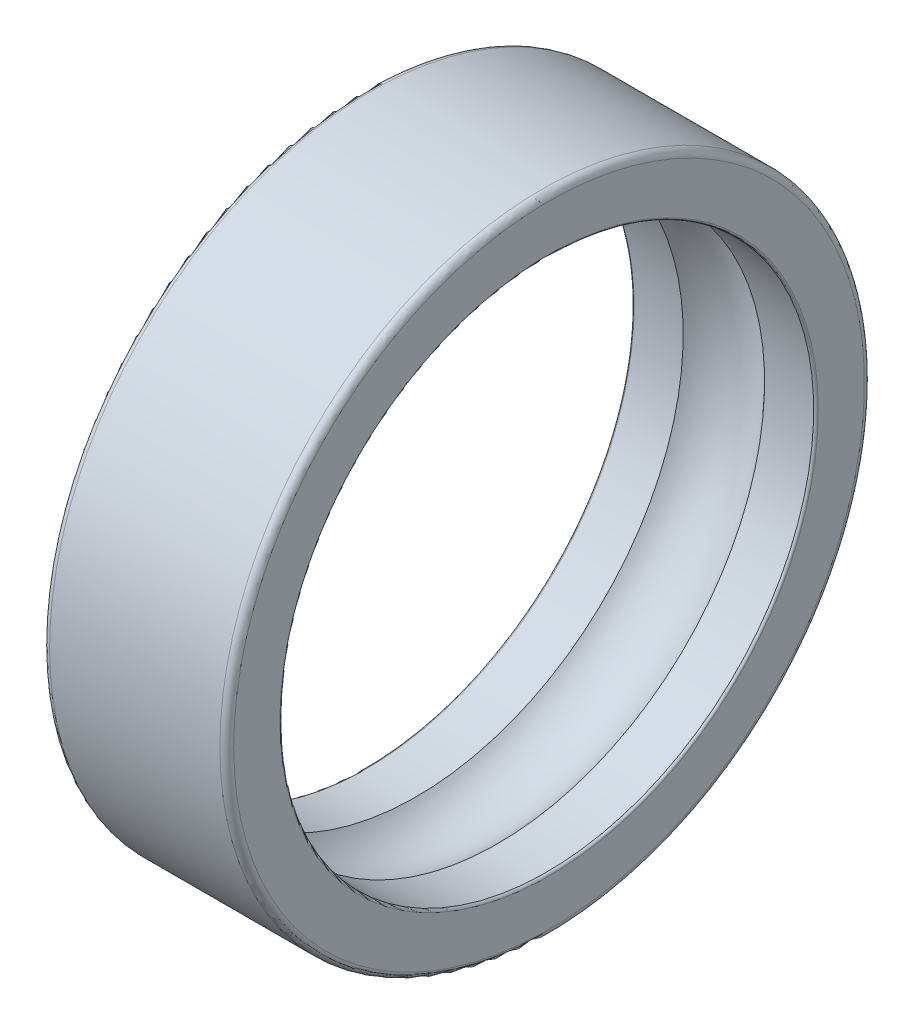
ISO-10303-21;
HEADER;
FILE_DESCRIPTION(('STEP AP214'),'2;1');
FILE_NAME('part.step','',(''),(''),'','','');
FILE_SCHEMA(('AUTOMOTIVE_DESIGN { 1 0 10303 214 1 1 1 1 }'));
ENDSEC;
DATA;
#1=APPLICATION_CONTEXT('core data for automotive mechanical design processes');
#2=APPLICATION_PROTOCOL_DEFINITION('international standard','automotive_design',2000,#1);
#3=PRODUCT_CONTEXT('',#1,'mechanical');
#4=PRODUCT('Part','Part','',(#3));
#5=PRODUCT_RELATED_PRODUCT_CATEGORY('part','',(#4));
#6=PRODUCT_DEFINITION_FORMATION('','',#4);
#7=PRODUCT_DEFINITION_CONTEXT('part definition',#1,'design');
#8=PRODUCT_DEFINITION('design','',#6,#7);
#9=PRODUCT_DEFINITION_SHAPE('','',#8);
#10=(LENGTH_UNIT() NAMED_UNIT(*) SI_UNIT(.MILLI.,.METRE.));
#11=(NAMED_UNIT(*) PLANE_ANGLE_UNIT() SI_UNIT($,.RADIAN.));
#12=(NAMED_UNIT(*) SI_UNIT($,.STERADIAN.) SOLID_ANGLE_UNIT());
#13=UNCERTAINTY_MEASURE_WITH_UNIT(LENGTH_MEASURE(1.E-05),#10,'distance_accuracy_value','');
#14=(GEOMETRIC_REPRESENTATION_CONTEXT(3) GLOBAL_UNCERTAINTY_ASSIGNED_CONTEXT((#13)) GLOBAL_UNIT_ASSIGNED_CONTEXT((#10,
#11,#12)) REPRESENTATION_CONTEXT('',''));
#15=CARTESIAN_POINT('',(0.,0.,0.));
#16=DIRECTION('',(0.,0.,1.));
#17=DIRECTION('',(1.,0.,0.));
#18=AXIS2_PLACEMENT_3D('',#15,#16,#17);
#19=CARTESIAN_POINT('',(0.29999999999994,0.,0.));
#20=DIRECTION('',(-1.,0.,0.));
#21=DIRECTION('',(0.,0.,1.));
#22=AXIS2_PLACEMENT_3D('',#19,#20,#21);
#23=TOROIDAL_SURFACE('',#22,13.7000000000001,0.29999999999994);
#24=CARTESIAN_POINT('',(0.,0.,0.));
#25=DIRECTION('',(-1.,0.,0.));
#26=DIRECTION('',(0.,0.,1.));
#27=AXIS2_PLACEMENT_3D('',#24,#25,#26);
#28=CIRCLE('',#27,13.7);
#29=CARTESIAN_POINT('',(0.,0.,13.7));
#30=VERTEX_POINT('',#29);
#31=EDGE_CURVE('E10',#30,#30,#28,.T.);
#32=ORIENTED_EDGE('',*,*,#31,.F.);
#33=EDGE_LOOP('',(#32));
#34=FACE_BOUND('',#33,.T.);
#35=CARTESIAN_POINT('',(0.300000000000002,0.,0.));
#36=DIRECTION('',(-1.,0.,0.));
#37=DIRECTION('',(0.,0.,1.));
#38=AXIS2_PLACEMENT_3D('',#35,#36,#37);
#39=CIRCLE('',#38,14.);
#40=CARTESIAN_POINT('',(0.300000000000002,0.,14.));
#41=VERTEX_POINT('',#40);
#42=EDGE_CURVE('E65',#41,#41,#39,.T.);
#43=ORIENTED_EDGE('',*,*,#42,.T.);
#44=EDGE_LOOP('',(#43));
#45=FACE_BOUND('',#44,.T.);
#46=ADVANCED_FACE('F31',(#34,#45),#23,.T.);
#47=CARTESIAN_POINT('',(0.,13.7,0.));
#48=DIRECTION('',(1.,0.,0.));
#49=DIRECTION('',(0.,0.,-1.));
#50=AXIS2_PLACEMENT_3D('',#47,#48,#49);
#51=PLANE('',#50);
#52=CARTESIAN_POINT('',(0.,0.,0.));
#53=DIRECTION('',(-1.,0.,0.));
#54=DIRECTION('',(0.,0.,1.));
#55=AXIS2_PLACEMENT_3D('',#52,#53,#54);
#56=CIRCLE('',#55,11.695);
#57=CARTESIAN_POINT('',(0.,0.,11.695));
#58=VERTEX_POINT('',#57);
#59=EDGE_CURVE('E37',#58,#58,#56,.T.);
#60=ORIENTED_EDGE('',*,*,#59,.F.);
#61=EDGE_LOOP('',(#60));
#62=FACE_BOUND('',#61,.T.);
#63=ORIENTED_EDGE('',*,*,#31,.T.);
#64=EDGE_LOOP('',(#63));
#65=FACE_BOUND('',#64,.T.);
#66=ADVANCED_FACE('F114',(#62,#65),#51,.F.);
#67=CARTESIAN_POINT('',(0.0999999999994125,0.,0.));
#68=DIRECTION('',(-1.,0.,0.));
#69=DIRECTION('',(0.,0.,1.));
#70=AXIS2_PLACEMENT_3D('',#67,#68,#69);
#71=TOROIDAL_SURFACE('',#70,11.6949999999994,0.0999999999994128);
#72=CARTESIAN_POINT('',(0.100000000000003,0.,0.));
#73=DIRECTION('',(-1.,0.,0.));
#74=DIRECTION('',(0.,0.,1.));
#75=AXIS2_PLACEMENT_3D('',#72,#73,#74);
#76=CIRCLE('',#75,11.595);
#77=CARTESIAN_POINT('',(0.100000000000003,0.,11.595));
#78=VERTEX_POINT('',#77);
#79=EDGE_CURVE('E41',#78,#78,#76,.T.);
#80=ORIENTED_EDGE('',*,*,#79,.F.);
#81=EDGE_LOOP('',(#80));
#82=FACE_BOUND('',#81,.T.);
#83=ORIENTED_EDGE('',*,*,#59,.T.);
#84=EDGE_LOOP('',(#83));
#85=FACE_BOUND('',#84,.T.);
#86=ADVANCED_FACE('F109',(#82,#85),#71,.T.);
#87=CARTESIAN_POINT('',(50.,0.,0.));
#88=DIRECTION('',(-1.,0.,0.));
#89=DIRECTION('',(0.,0.,1.));
#90=AXIS2_PLACEMENT_3D('',#87,#88,#89);
#91=CYLINDRICAL_SURFACE('',#90,11.595);
#92=CARTESIAN_POINT('',(2.2321945808432,0.,0.));
#93=DIRECTION('',(-1.,0.,0.));
#94=DIRECTION('',(0.,0.,1.));
#95=AXIS2_PLACEMENT_3D('',#92,#93,#94);
#96=CIRCLE('',#95,11.595);
#97=CARTESIAN_POINT('',(2.2321945808432,0.,11.595));
#98=VERTEX_POINT('',#97);
#99=EDGE_CURVE('E45',#98,#98,#96,.T.);
#100=ORIENTED_EDGE('',*,*,#99,.F.);
#101=EDGE_LOOP('',(#100));
#102=FACE_BOUND('',#101,.T.);
#103=ORIENTED_EDGE('',*,*,#79,.T.);
#104=EDGE_LOOP('',(#103));
#105=FACE_BOUND('',#104,.T.);
#106=ADVANCED_FACE('F103',(#102,#105),#91,.F.);
#107=CARTESIAN_POINT('',(4.,0.,0.));
#108=DIRECTION('',(-1.,0.,0.));
#109=DIRECTION('',(0.,0.,1.));
#110=AXIS2_PLACEMENT_3D('',#107,#108,#109);
#111=TOROIDAL_SURFACE('',#110,9.9999999999999,2.3810000000001);
#112=CARTESIAN_POINT('',(5.7678054191568,0.,0.));
#113=DIRECTION('',(-1.,0.,0.));
#114=DIRECTION('',(0.,0.,1.));
#115=AXIS2_PLACEMENT_3D('',#112,#113,#114);
#116=CIRCLE('',#115,11.595);
#117=CARTESIAN_POINT('',(5.7678054191568,0.,11.595));
#118=VERTEX_POINT('',#117);
#119=EDGE_CURVE('E50',#118,#118,#116,.T.);
#120=ORIENTED_EDGE('',*,*,#119,.F.);
#121=EDGE_LOOP('',(#120));
#122=FACE_BOUND('',#121,.T.);
#123=ORIENTED_EDGE('',*,*,#99,.T.);
#124=EDGE_LOOP('',(#123));
#125=FACE_BOUND('',#124,.T.);
#126=ADVANCED_FACE('F97',(#122,#125),#111,.F.);
#127=CARTESIAN_POINT('',(50.,0.,0.));
#128=DIRECTION('',(-1.,0.,0.));
#129=DIRECTION('',(0.,0.,1.));
#130=AXIS2_PLACEMENT_3D('',#127,#128,#129);
#131=CYLINDRICAL_SURFACE('',#130,11.595);
#132=CARTESIAN_POINT('',(7.9,0.,0.));
#133=DIRECTION('',(-1.,0.,0.));
#134=DIRECTION('',(0.,0.,1.));
#135=AXIS2_PLACEMENT_3D('',#132,#133,#134);
#136=CIRCLE('',#135,11.595);
#137=CARTESIAN_POINT('',(7.9,0.,11.595));
#138=VERTEX_POINT('',#137);
#139=EDGE_CURVE('E53',#138,#138,#136,.T.);
#140=ORIENTED_EDGE('',*,*,#139,.F.);
#141=EDGE_LOOP('',(#140));
#142=FACE_BOUND('',#141,.T.);
#143=ORIENTED_EDGE('',*,*,#119,.T.);
#144=EDGE_LOOP('',(#143));
#145=FACE_BOUND('',#144,.T.);
#146=ADVANCED_FACE('F91',(#142,#145),#131,.F.);
#147=CARTESIAN_POINT('',(7.90000000000067,0.,0.));
#148=DIRECTION('',(-1.,0.,0.));
#149=DIRECTION('',(0.,0.,1.));
#150=AXIS2_PLACEMENT_3D('',#147,#148,#149);
#151=TOROIDAL_SURFACE('',#150,11.6949999999993,0.0999999999993333);
#152=CARTESIAN_POINT('',(8.,0.,0.));
#153=DIRECTION('',(-1.,0.,0.));
#154=DIRECTION('',(0.,0.,1.));
#155=AXIS2_PLACEMENT_3D('',#152,#153,#154);
#156=CIRCLE('',#155,11.695);
#157=CARTESIAN_POINT('',(8.,0.,11.695));
#158=VERTEX_POINT('',#157);
#159=EDGE_CURVE('E56',#158,#158,#156,.T.);
#160=ORIENTED_EDGE('',*,*,#159,.F.);
#161=EDGE_LOOP('',(#160));
#162=FACE_BOUND('',#161,.T.);
#163=ORIENTED_EDGE('',*,*,#139,.T.);
#164=EDGE_LOOP('',(#163));
#165=FACE_BOUND('',#164,.T.);
#166=ADVANCED_FACE('F85',(#162,#165),#151,.T.);
#167=CARTESIAN_POINT('',(8.,11.695,0.));
#168=DIRECTION('',(-1.,0.,0.));
#169=DIRECTION('',(0.,0.,1.));
#170=AXIS2_PLACEMENT_3D('',#167,#168,#169);
#171=PLANE('',#170);
#172=CARTESIAN_POINT('',(8.,0.,0.));
#173=DIRECTION('',(-1.,0.,0.));
#174=DIRECTION('',(0.,0.,1.));
#175=AXIS2_PLACEMENT_3D('',#172,#173,#174);
#176=CIRCLE('',#175,13.7);
#177=CARTESIAN_POINT('',(8.,0.,13.7));
#178=VERTEX_POINT('',#177);
#179=EDGE_CURVE('E59',#178,#178,#176,.T.);
#180=ORIENTED_EDGE('',*,*,#179,.F.);
#181=EDGE_LOOP('',(#180));
#182=FACE_BOUND('',#181,.T.);
#183=ORIENTED_EDGE('',*,*,#159,.T.);
#184=EDGE_LOOP('',(#183));
#185=FACE_BOUND('',#184,.T.);
#186=ADVANCED_FACE('F79',(#182,#185),#171,.F.);
#187=CARTESIAN_POINT('',(7.70000000000012,0.,0.));
#188=DIRECTION('',(-1.,0.,0.));
#189=DIRECTION('',(0.,0.,1.));
#190=AXIS2_PLACEMENT_3D('',#187,#188,#189);
#191=TOROIDAL_SURFACE('',#190,13.7000000000001,0.29999999999988);
#192=CARTESIAN_POINT('',(7.7,0.,0.));
#193=DIRECTION('',(-1.,0.,0.));
#194=DIRECTION('',(0.,0.,1.));
#195=AXIS2_PLACEMENT_3D('',#192,#193,#194);
#196=CIRCLE('',#195,14.);
#197=CARTESIAN_POINT('',(7.7,0.,14.));
#198=VERTEX_POINT('',#197);
#199=EDGE_CURVE('E62',#198,#198,#196,.T.);
#200=ORIENTED_EDGE('',*,*,#199,.F.);
#201=EDGE_LOOP('',(#200));
#202=FACE_BOUND('',#201,.T.);
#203=ORIENTED_EDGE('',*,*,#179,.T.);
#204=EDGE_LOOP('',(#203));
#205=FACE_BOUND('',#204,.T.);
#206=ADVANCED_FACE('F73',(#202,#205),#191,.T.);
#207=CARTESIAN_POINT('',(50.,0.,0.));
#208=DIRECTION('',(-1.,0.,0.));
#209=DIRECTION('',(0.,0.,1.));
#210=AXIS2_PLACEMENT_3D('',#207,#208,#209);
#211=CYLINDRICAL_SURFACE('',#210,14.);
#212=ORIENTED_EDGE('',*,*,#42,.F.);
#213=EDGE_LOOP('',(#212));
#214=FACE_BOUND('',#213,.T.);
#215=ORIENTED_EDGE('',*,*,#199,.T.);
#216=EDGE_LOOP('',(#215));
#217=FACE_BOUND('',#216,.T.);
#218=ADVANCED_FACE('F70',(#214,#217),#211,.T.);
#219=CLOSED_SHELL('',(#46,#66,#86,#106,#126,#146,#166,#186,#206,#218));
#220=MANIFOLD_SOLID_BREP('B2',#219);
#221=ADVANCED_BREP_SHAPE_REPRESENTATION('',(#18,#220),#14);
#222=SHAPE_DEFINITION_REPRESENTATION(#9,#221);
ENDSEC;
END-ISO-10303-21;
